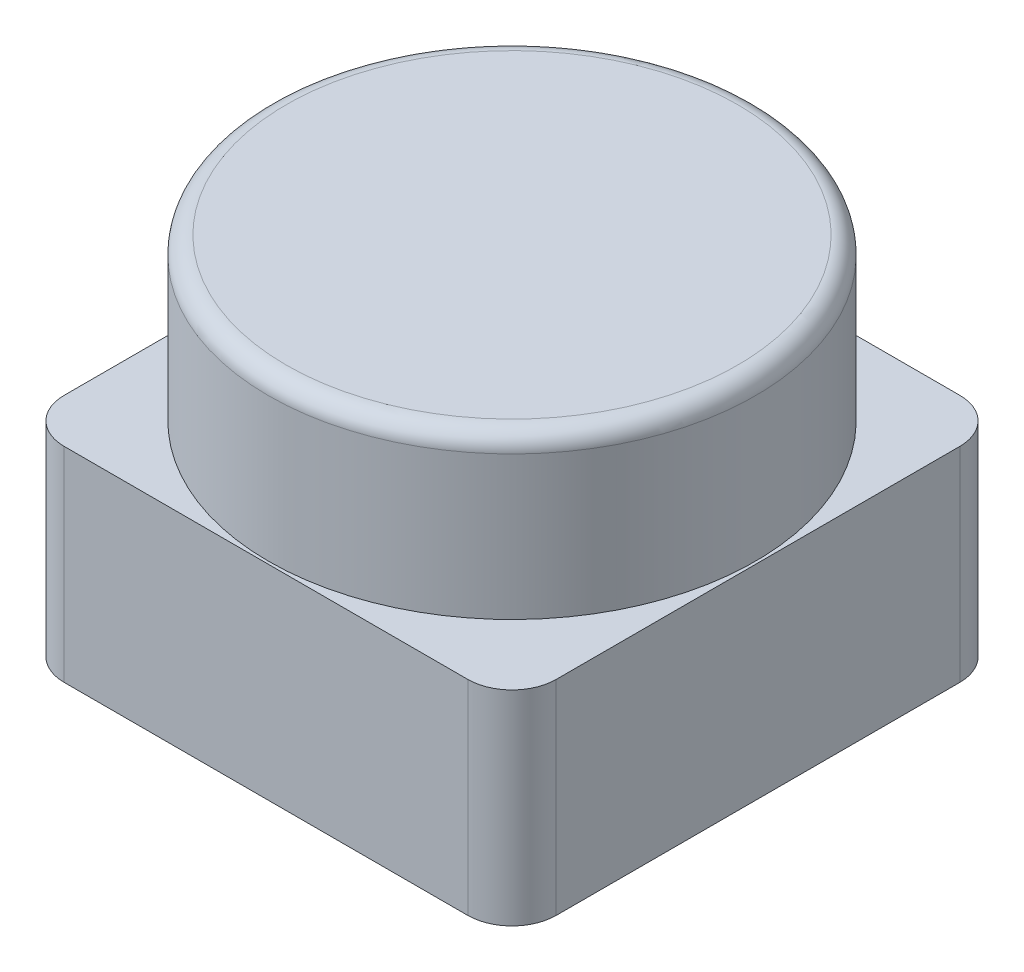
ISO-10303-21;
HEADER;
FILE_DESCRIPTION(('STEP AP214'),'2;1');
FILE_NAME('part.step','',(''),(''),'','','');
FILE_SCHEMA(('AUTOMOTIVE_DESIGN { 1 0 10303 214 1 1 1 1 }'));
ENDSEC;
DATA;
#1=APPLICATION_CONTEXT('core data for automotive mechanical design processes');
#2=APPLICATION_PROTOCOL_DEFINITION('international standard','automotive_design',2000,#1);
#3=PRODUCT_CONTEXT('',#1,'mechanical');
#4=PRODUCT('Part','Part','',(#3));
#5=PRODUCT_RELATED_PRODUCT_CATEGORY('part','',(#4));
#6=PRODUCT_DEFINITION_FORMATION('','',#4);
#7=PRODUCT_DEFINITION_CONTEXT('part definition',#1,'design');
#8=PRODUCT_DEFINITION('design','',#6,#7);
#9=PRODUCT_DEFINITION_SHAPE('','',#8);
#10=(LENGTH_UNIT() NAMED_UNIT(*) SI_UNIT(.MILLI.,.METRE.));
#11=(NAMED_UNIT(*) PLANE_ANGLE_UNIT() SI_UNIT($,.RADIAN.));
#12=(NAMED_UNIT(*) SI_UNIT($,.STERADIAN.) SOLID_ANGLE_UNIT());
#13=UNCERTAINTY_MEASURE_WITH_UNIT(LENGTH_MEASURE(1.E-05),#10,'distance_accuracy_value','');
#14=(GEOMETRIC_REPRESENTATION_CONTEXT(3) GLOBAL_UNCERTAINTY_ASSIGNED_CONTEXT((#13)) GLOBAL_UNIT_ASSIGNED_CONTEXT((#10,
#11,#12)) REPRESENTATION_CONTEXT('',''));
#15=CARTESIAN_POINT('',(0.,0.,0.));
#16=DIRECTION('',(0.,0.,1.));
#17=DIRECTION('',(1.,0.,0.));
#18=AXIS2_PLACEMENT_3D('',#15,#16,#17);
#19=CARTESIAN_POINT('',(27.8,23.1,27.8));
#20=DIRECTION('',(-1.,0.,0.));
#21=DIRECTION('',(0.,0.,1.));
#22=AXIS2_PLACEMENT_3D('',#19,#20,#21);
#23=PLANE('',#22);
#24=DIRECTION('',(0.,0.,-1.));
#25=VECTOR('',#24,1.);
#26=CARTESIAN_POINT('',(27.8,23.1,27.8));
#27=LINE('',#26,#25);
#28=CARTESIAN_POINT('',(27.8,23.1,22.8));
#29=VERTEX_POINT('',#28);
#30=CARTESIAN_POINT('',(27.8,23.1,-22.8));
#31=VERTEX_POINT('',#30);
#32=EDGE_CURVE('E127',#29,#31,#27,.T.);
#33=ORIENTED_EDGE('',*,*,#32,.F.);
#34=DIRECTION('',(0.,-1.,0.));
#35=VECTOR('',#34,1.);
#36=CARTESIAN_POINT('',(27.8,23.1,22.8));
#37=LINE('',#36,#35);
#38=CARTESIAN_POINT('',(27.8,0.,22.8));
#39=VERTEX_POINT('',#38);
#40=EDGE_CURVE('E112',#29,#39,#37,.T.);
#41=ORIENTED_EDGE('',*,*,#40,.T.);
#42=DIRECTION('',(0.,0.,-1.));
#43=VECTOR('',#42,1.);
#44=CARTESIAN_POINT('',(27.8,0.,27.8));
#45=LINE('',#44,#43);
#46=CARTESIAN_POINT('',(27.8,0.,-22.8));
#47=VERTEX_POINT('',#46);
#48=EDGE_CURVE('E124',#39,#47,#45,.T.);
#49=ORIENTED_EDGE('',*,*,#48,.T.);
#50=DIRECTION('',(0.,-1.,0.));
#51=VECTOR('',#50,1.);
#52=CARTESIAN_POINT('',(27.8,23.1,-22.8));
#53=LINE('',#52,#51);
#54=EDGE_CURVE('E129',#47,#31,#53,.F.);
#55=ORIENTED_EDGE('',*,*,#54,.T.);
#56=EDGE_LOOP('',(#33,#41,#49,#55));
#57=FACE_BOUND('',#56,.T.);
#58=ADVANCED_FACE('F41',(#57),#23,.F.);
#59=CARTESIAN_POINT('',(-27.8,23.1,-27.8));
#60=DIRECTION('',(0.,0.,1.));
#61=DIRECTION('',(1.,0.,0.));
#62=AXIS2_PLACEMENT_3D('',#59,#60,#61);
#63=PLANE('',#62);
#64=DIRECTION('',(-1.,0.,0.));
#65=VECTOR('',#64,1.);
#66=CARTESIAN_POINT('',(-27.8,0.,-27.8));
#67=LINE('',#66,#65);
#68=CARTESIAN_POINT('',(22.8,0.,-27.8));
#69=VERTEX_POINT('',#68);
#70=CARTESIAN_POINT('',(-22.8,0.,-27.8));
#71=VERTEX_POINT('',#70);
#72=EDGE_CURVE('E133',#69,#71,#67,.T.);
#73=ORIENTED_EDGE('',*,*,#72,.T.);
#74=DIRECTION('',(0.,-1.,0.));
#75=VECTOR('',#74,1.);
#76=CARTESIAN_POINT('',(-22.8,23.1,-27.8));
#77=LINE('',#76,#75);
#78=CARTESIAN_POINT('',(-22.8,23.1,-27.8));
#79=VERTEX_POINT('',#78);
#80=EDGE_CURVE('E172',#71,#79,#77,.F.);
#81=ORIENTED_EDGE('',*,*,#80,.T.);
#82=DIRECTION('',(-1.,0.,0.));
#83=VECTOR('',#82,1.);
#84=CARTESIAN_POINT('',(-27.8,23.1,-27.8));
#85=LINE('',#84,#83);
#86=CARTESIAN_POINT('',(22.8,23.1,-27.8));
#87=VERTEX_POINT('',#86);
#88=EDGE_CURVE('E223',#87,#79,#85,.T.);
#89=ORIENTED_EDGE('',*,*,#88,.F.);
#90=DIRECTION('',(0.,-1.,0.));
#91=VECTOR('',#90,1.);
#92=CARTESIAN_POINT('',(22.8,23.1,-27.8));
#93=LINE('',#92,#91);
#94=EDGE_CURVE('E169',#87,#69,#93,.T.);
#95=ORIENTED_EDGE('',*,*,#94,.T.);
#96=EDGE_LOOP('',(#73,#81,#89,#95));
#97=FACE_BOUND('',#96,.T.);
#98=ADVANCED_FACE('F189',(#97),#63,.F.);
#99=CARTESIAN_POINT('',(-27.8,23.1,27.8));
#100=DIRECTION('',(1.,0.,0.));
#101=DIRECTION('',(0.,0.,-1.));
#102=AXIS2_PLACEMENT_3D('',#99,#100,#101);
#103=PLANE('',#102);
#104=DIRECTION('',(0.,0.,1.));
#105=VECTOR('',#104,1.);
#106=CARTESIAN_POINT('',(-27.8,0.,27.8));
#107=LINE('',#106,#105);
#108=CARTESIAN_POINT('',(-27.8,0.,-22.8));
#109=VERTEX_POINT('',#108);
#110=CARTESIAN_POINT('',(-27.8,0.,22.8));
#111=VERTEX_POINT('',#110);
#112=EDGE_CURVE('E137',#109,#111,#107,.T.);
#113=ORIENTED_EDGE('',*,*,#112,.T.);
#114=DIRECTION('',(0.,-1.,0.));
#115=VECTOR('',#114,1.);
#116=CARTESIAN_POINT('',(-27.8,23.1,22.8));
#117=LINE('',#116,#115);
#118=CARTESIAN_POINT('',(-27.8,23.1,22.8));
#119=VERTEX_POINT('',#118);
#120=EDGE_CURVE('E56',#111,#119,#117,.F.);
#121=ORIENTED_EDGE('',*,*,#120,.T.);
#122=DIRECTION('',(0.,0.,1.));
#123=VECTOR('',#122,1.);
#124=CARTESIAN_POINT('',(-27.8,23.1,27.8));
#125=LINE('',#124,#123);
#126=CARTESIAN_POINT('',(-27.8,23.1,-22.8));
#127=VERTEX_POINT('',#126);
#128=EDGE_CURVE('E214',#127,#119,#125,.T.);
#129=ORIENTED_EDGE('',*,*,#128,.F.);
#130=DIRECTION('',(0.,-1.,0.));
#131=VECTOR('',#130,1.);
#132=CARTESIAN_POINT('',(-27.8,23.1,-22.8));
#133=LINE('',#132,#131);
#134=EDGE_CURVE('E165',#127,#109,#133,.T.);
#135=ORIENTED_EDGE('',*,*,#134,.T.);
#136=EDGE_LOOP('',(#113,#121,#129,#135));
#137=FACE_BOUND('',#136,.T.);
#138=ADVANCED_FACE('F195',(#137),#103,.F.);
#139=CARTESIAN_POINT('',(-27.8,23.1,27.8));
#140=DIRECTION('',(0.,0.,-1.));
#141=DIRECTION('',(-1.,0.,0.));
#142=AXIS2_PLACEMENT_3D('',#139,#140,#141);
#143=PLANE('',#142);
#144=DIRECTION('',(1.,0.,0.));
#145=VECTOR('',#144,1.);
#146=CARTESIAN_POINT('',(-27.8,0.,27.8));
#147=LINE('',#146,#145);
#148=CARTESIAN_POINT('',(-22.8,0.,27.8));
#149=VERTEX_POINT('',#148);
#150=CARTESIAN_POINT('',(22.8,0.,27.8));
#151=VERTEX_POINT('',#150);
#152=EDGE_CURVE('E147',#149,#151,#147,.T.);
#153=ORIENTED_EDGE('',*,*,#152,.T.);
#154=DIRECTION('',(0.,-1.,0.));
#155=VECTOR('',#154,1.);
#156=CARTESIAN_POINT('',(22.8,23.1,27.8));
#157=LINE('',#156,#155);
#158=CARTESIAN_POINT('',(22.8,23.1,27.8));
#159=VERTEX_POINT('',#158);
#160=EDGE_CURVE('E113',#151,#159,#157,.F.);
#161=ORIENTED_EDGE('',*,*,#160,.T.);
#162=DIRECTION('',(1.,0.,0.));
#163=VECTOR('',#162,1.);
#164=CARTESIAN_POINT('',(-27.8,23.1,27.8));
#165=LINE('',#164,#163);
#166=CARTESIAN_POINT('',(-22.8,23.1,27.8));
#167=VERTEX_POINT('',#166);
#168=EDGE_CURVE('E143',#167,#159,#165,.T.);
#169=ORIENTED_EDGE('',*,*,#168,.F.);
#170=DIRECTION('',(0.,-1.,0.));
#171=VECTOR('',#170,1.);
#172=CARTESIAN_POINT('',(-22.8,23.1,27.8));
#173=LINE('',#172,#171);
#174=EDGE_CURVE('E118',#167,#149,#173,.T.);
#175=ORIENTED_EDGE('',*,*,#174,.T.);
#176=EDGE_LOOP('',(#153,#161,#169,#175));
#177=FACE_BOUND('',#176,.T.);
#178=ADVANCED_FACE('F219',(#177),#143,.F.);
#179=CARTESIAN_POINT('',(0.,23.1,0.));
#180=DIRECTION('',(0.,-1.,0.));
#181=DIRECTION('',(0.,0.,-1.));
#182=AXIS2_PLACEMENT_3D('',#179,#180,#181);
#183=PLANE('',#182);
#184=CARTESIAN_POINT('',(0.,23.1,0.));
#185=DIRECTION('',(0.,1.,0.));
#186=DIRECTION('',(0.,0.,1.));
#187=AXIS2_PLACEMENT_3D('',#184,#185,#186);
#188=CIRCLE('',#187,27.5);
#189=CARTESIAN_POINT('',(0.,23.1,27.5));
#190=VERTEX_POINT('',#189);
#191=EDGE_CURVE('E149',#190,#190,#188,.T.);
#192=ORIENTED_EDGE('',*,*,#191,.F.);
#193=EDGE_LOOP('',(#192));
#194=FACE_BOUND('',#193,.T.);
#195=ORIENTED_EDGE('',*,*,#168,.T.);
#196=CARTESIAN_POINT('',(22.8,23.1,22.8));
#197=DIRECTION('',(0.,-1.,0.));
#198=DIRECTION('',(0.,0.,-1.));
#199=AXIS2_PLACEMENT_3D('',#196,#197,#198);
#200=CIRCLE('',#199,5.);
#201=EDGE_CURVE('E163',#159,#29,#200,.F.);
#202=ORIENTED_EDGE('',*,*,#201,.T.);
#203=ORIENTED_EDGE('',*,*,#32,.T.);
#204=CARTESIAN_POINT('',(22.8,23.1,-22.8));
#205=DIRECTION('',(0.,-1.,0.));
#206=DIRECTION('',(0.,0.,-1.));
#207=AXIS2_PLACEMENT_3D('',#204,#205,#206);
#208=CIRCLE('',#207,5.);
#209=EDGE_CURVE('E158',#31,#87,#208,.F.);
#210=ORIENTED_EDGE('',*,*,#209,.T.);
#211=ORIENTED_EDGE('',*,*,#88,.T.);
#212=CARTESIAN_POINT('',(-22.8,23.1,-22.8));
#213=DIRECTION('',(0.,-1.,0.));
#214=DIRECTION('',(0.,0.,-1.));
#215=AXIS2_PLACEMENT_3D('',#212,#213,#214);
#216=CIRCLE('',#215,5.);
#217=EDGE_CURVE('E63',#79,#127,#216,.F.);
#218=ORIENTED_EDGE('',*,*,#217,.T.);
#219=ORIENTED_EDGE('',*,*,#128,.T.);
#220=CARTESIAN_POINT('',(-22.8,23.1,22.8));
#221=DIRECTION('',(0.,-1.,0.));
#222=DIRECTION('',(0.,0.,-1.));
#223=AXIS2_PLACEMENT_3D('',#220,#221,#222);
#224=CIRCLE('',#223,5.);
#225=EDGE_CURVE('E161',#119,#167,#224,.F.);
#226=ORIENTED_EDGE('',*,*,#225,.T.);
#227=EDGE_LOOP('',(#195,#202,#203,#210,#211,#218,#219,#226));
#228=FACE_BOUND('',#227,.T.);
#229=ADVANCED_FACE('F252',(#194,#228),#183,.F.);
#230=CARTESIAN_POINT('',(0.,0.,0.));
#231=DIRECTION('',(0.,-1.,0.));
#232=DIRECTION('',(0.,0.,-1.));
#233=AXIS2_PLACEMENT_3D('',#230,#231,#232);
#234=PLANE('',#233);
#235=CARTESIAN_POINT('',(21.5,0.,-21.5));
#236=DIRECTION('',(0.,-1.,0.));
#237=DIRECTION('',(0.,0.,-1.));
#238=AXIS2_PLACEMENT_3D('',#235,#236,#237);
#239=CIRCLE('',#238,1.25000000000002);
#240=CARTESIAN_POINT('',(21.5,0.,-22.75));
#241=VERTEX_POINT('',#240);
#242=EDGE_CURVE('E244',#241,#241,#239,.T.);
#243=ORIENTED_EDGE('',*,*,#242,.F.);
#244=EDGE_LOOP('',(#243));
#245=FACE_BOUND('',#244,.T.);
#246=CARTESIAN_POINT('',(-21.5,0.,-21.5));
#247=DIRECTION('',(0.,-1.,0.));
#248=DIRECTION('',(0.,0.,-1.));
#249=AXIS2_PLACEMENT_3D('',#246,#247,#248);
#250=CIRCLE('',#249,1.25000000000002);
#251=CARTESIAN_POINT('',(-21.5,0.,-22.75));
#252=VERTEX_POINT('',#251);
#253=EDGE_CURVE('E238',#252,#252,#250,.T.);
#254=ORIENTED_EDGE('',*,*,#253,.F.);
#255=EDGE_LOOP('',(#254));
#256=FACE_BOUND('',#255,.T.);
#257=CARTESIAN_POINT('',(-21.5,0.,21.5));
#258=DIRECTION('',(0.,-1.,0.));
#259=DIRECTION('',(0.,0.,-1.));
#260=AXIS2_PLACEMENT_3D('',#257,#258,#259);
#261=CIRCLE('',#260,1.25000000000002);
#262=CARTESIAN_POINT('',(-21.5,0.,20.25));
#263=VERTEX_POINT('',#262);
#264=EDGE_CURVE('E232',#263,#263,#261,.T.);
#265=ORIENTED_EDGE('',*,*,#264,.F.);
#266=EDGE_LOOP('',(#265));
#267=FACE_BOUND('',#266,.T.);
#268=CARTESIAN_POINT('',(21.5,0.,21.5));
#269=DIRECTION('',(0.,-1.,0.));
#270=DIRECTION('',(0.,0.,-1.));
#271=AXIS2_PLACEMENT_3D('',#268,#269,#270);
#272=CIRCLE('',#271,1.25000000000002);
#273=CARTESIAN_POINT('',(21.5,0.,20.25));
#274=VERTEX_POINT('',#273);
#275=EDGE_CURVE('E140',#274,#274,#272,.T.);
#276=ORIENTED_EDGE('',*,*,#275,.F.);
#277=EDGE_LOOP('',(#276));
#278=FACE_BOUND('',#277,.T.);
#279=ORIENTED_EDGE('',*,*,#48,.F.);
#280=CARTESIAN_POINT('',(22.8,0.,22.8));
#281=DIRECTION('',(0.,-1.,0.));
#282=DIRECTION('',(0.,0.,-1.));
#283=AXIS2_PLACEMENT_3D('',#280,#281,#282);
#284=CIRCLE('',#283,5.);
#285=EDGE_CURVE('E108',#39,#151,#284,.T.);
#286=ORIENTED_EDGE('',*,*,#285,.T.);
#287=ORIENTED_EDGE('',*,*,#152,.F.);
#288=CARTESIAN_POINT('',(-22.8,0.,22.8));
#289=DIRECTION('',(0.,-1.,0.));
#290=DIRECTION('',(0.,0.,-1.));
#291=AXIS2_PLACEMENT_3D('',#288,#289,#290);
#292=CIRCLE('',#291,5.);
#293=EDGE_CURVE('E119',#149,#111,#292,.T.);
#294=ORIENTED_EDGE('',*,*,#293,.T.);
#295=ORIENTED_EDGE('',*,*,#112,.F.);
#296=CARTESIAN_POINT('',(-22.8,0.,-22.8));
#297=DIRECTION('',(0.,-1.,0.));
#298=DIRECTION('',(0.,0.,-1.));
#299=AXIS2_PLACEMENT_3D('',#296,#297,#298);
#300=CIRCLE('',#299,5.);
#301=EDGE_CURVE('E152',#109,#71,#300,.T.);
#302=ORIENTED_EDGE('',*,*,#301,.T.);
#303=ORIENTED_EDGE('',*,*,#72,.F.);
#304=CARTESIAN_POINT('',(22.8,0.,-22.8));
#305=DIRECTION('',(0.,-1.,0.));
#306=DIRECTION('',(0.,0.,-1.));
#307=AXIS2_PLACEMENT_3D('',#304,#305,#306);
#308=CIRCLE('',#307,5.);
#309=EDGE_CURVE('E128',#69,#47,#308,.T.);
#310=ORIENTED_EDGE('',*,*,#309,.T.);
#311=EDGE_LOOP('',(#279,#286,#287,#294,#295,#302,#303,#310));
#312=FACE_BOUND('',#311,.T.);
#313=ADVANCED_FACE('F131',(#245,#256,#267,#278,#312),#234,.T.);
#314=CARTESIAN_POINT('',(0.,41.3,0.));
#315=DIRECTION('',(0.,-1.,0.));
#316=DIRECTION('',(0.,0.,-1.));
#317=AXIS2_PLACEMENT_3D('',#314,#315,#316);
#318=CYLINDRICAL_SURFACE('',#317,27.5);
#319=CARTESIAN_POINT('',(0.,39.3,0.));
#320=DIRECTION('',(0.,1.,0.));
#321=DIRECTION('',(0.,0.,1.));
#322=AXIS2_PLACEMENT_3D('',#319,#320,#321);
#323=CIRCLE('',#322,27.5);
#324=CARTESIAN_POINT('',(0.,39.3,27.5));
#325=VERTEX_POINT('',#324);
#326=EDGE_CURVE('E11',#325,#325,#323,.F.);
#327=ORIENTED_EDGE('',*,*,#326,.T.);
#328=EDGE_LOOP('',(#327));
#329=FACE_BOUND('',#328,.T.);
#330=ORIENTED_EDGE('',*,*,#191,.T.);
#331=EDGE_LOOP('',(#330));
#332=FACE_BOUND('',#331,.T.);
#333=ADVANCED_FACE('F251',(#329,#332),#318,.T.);
#334=CARTESIAN_POINT('',(0.,41.3,0.));
#335=DIRECTION('',(0.,1.,0.));
#336=DIRECTION('',(0.,0.,1.));
#337=AXIS2_PLACEMENT_3D('',#334,#335,#336);
#338=PLANE('',#337);
#339=CARTESIAN_POINT('',(0.,41.3,0.));
#340=DIRECTION('',(0.,1.,0.));
#341=DIRECTION('',(0.,0.,1.));
#342=AXIS2_PLACEMENT_3D('',#339,#340,#341);
#343=CIRCLE('',#342,25.5);
#344=CARTESIAN_POINT('',(0.,41.3,25.5));
#345=VERTEX_POINT('',#344);
#346=EDGE_CURVE('E49',#345,#345,#343,.T.);
#347=ORIENTED_EDGE('',*,*,#346,.T.);
#348=EDGE_LOOP('',(#347));
#349=FACE_BOUND('',#348,.T.);
#350=ADVANCED_FACE('F176',(#349),#338,.T.);
#351=CARTESIAN_POINT('',(21.5,4.,21.5));
#352=DIRECTION('',(0.,1.,0.));
#353=DIRECTION('',(0.,0.,1.));
#354=AXIS2_PLACEMENT_3D('',#351,#352,#353);
#355=PLANE('',#354);
#356=CARTESIAN_POINT('',(21.5,4.,21.5));
#357=DIRECTION('',(0.,-1.,0.));
#358=DIRECTION('',(0.,0.,-1.));
#359=AXIS2_PLACEMENT_3D('',#356,#357,#358);
#360=CIRCLE('',#359,1.25000000000001);
#361=CARTESIAN_POINT('',(21.5,4.,20.25));
#362=VERTEX_POINT('',#361);
#363=EDGE_CURVE('E134',#362,#362,#360,.T.);
#364=ORIENTED_EDGE('',*,*,#363,.T.);
#365=EDGE_LOOP('',(#364));
#366=FACE_BOUND('',#365,.T.);
#367=ADVANCED_FACE('F263',(#366),#355,.F.);
#368=CARTESIAN_POINT('',(21.5,0.,21.5));
#369=DIRECTION('',(0.,-1.,0.));
#370=DIRECTION('',(0.,0.,-1.));
#371=AXIS2_PLACEMENT_3D('',#368,#369,#370);
#372=CYLINDRICAL_SURFACE('',#371,1.25000000000001);
#373=ORIENTED_EDGE('',*,*,#363,.F.);
#374=EDGE_LOOP('',(#373));
#375=FACE_BOUND('',#374,.T.);
#376=ORIENTED_EDGE('',*,*,#275,.T.);
#377=EDGE_LOOP('',(#376));
#378=FACE_BOUND('',#377,.T.);
#379=ADVANCED_FACE('F260',(#375,#378),#372,.F.);
#380=CARTESIAN_POINT('',(-21.5,4.,21.5));
#381=DIRECTION('',(0.,1.,0.));
#382=DIRECTION('',(0.,0.,1.));
#383=AXIS2_PLACEMENT_3D('',#380,#381,#382);
#384=PLANE('',#383);
#385=CARTESIAN_POINT('',(-21.5,4.,21.5));
#386=DIRECTION('',(0.,-1.,0.));
#387=DIRECTION('',(0.,0.,-1.));
#388=AXIS2_PLACEMENT_3D('',#385,#386,#387);
#389=CIRCLE('',#388,1.25000000000001);
#390=CARTESIAN_POINT('',(-21.5,4.,20.25));
#391=VERTEX_POINT('',#390);
#392=EDGE_CURVE('E229',#391,#391,#389,.T.);
#393=ORIENTED_EDGE('',*,*,#392,.T.);
#394=EDGE_LOOP('',(#393));
#395=FACE_BOUND('',#394,.T.);
#396=ADVANCED_FACE('F262',(#395),#384,.F.);
#397=CARTESIAN_POINT('',(-21.5,0.,21.5));
#398=DIRECTION('',(0.,-1.,0.));
#399=DIRECTION('',(0.,0.,-1.));
#400=AXIS2_PLACEMENT_3D('',#397,#398,#399);
#401=CYLINDRICAL_SURFACE('',#400,1.25000000000001);
#402=ORIENTED_EDGE('',*,*,#392,.F.);
#403=EDGE_LOOP('',(#402));
#404=FACE_BOUND('',#403,.T.);
#405=ORIENTED_EDGE('',*,*,#264,.T.);
#406=EDGE_LOOP('',(#405));
#407=FACE_BOUND('',#406,.T.);
#408=ADVANCED_FACE('F270',(#404,#407),#401,.F.);
#409=CARTESIAN_POINT('',(-21.5,4.,-21.5));
#410=DIRECTION('',(0.,1.,0.));
#411=DIRECTION('',(0.,0.,1.));
#412=AXIS2_PLACEMENT_3D('',#409,#410,#411);
#413=PLANE('',#412);
#414=CARTESIAN_POINT('',(-21.5,4.,-21.5));
#415=DIRECTION('',(0.,-1.,0.));
#416=DIRECTION('',(0.,0.,-1.));
#417=AXIS2_PLACEMENT_3D('',#414,#415,#416);
#418=CIRCLE('',#417,1.25000000000001);
#419=CARTESIAN_POINT('',(-21.5,4.,-22.75));
#420=VERTEX_POINT('',#419);
#421=EDGE_CURVE('E235',#420,#420,#418,.T.);
#422=ORIENTED_EDGE('',*,*,#421,.T.);
#423=EDGE_LOOP('',(#422));
#424=FACE_BOUND('',#423,.T.);
#425=ADVANCED_FACE('F368',(#424),#413,.F.);
#426=CARTESIAN_POINT('',(-21.5,0.,-21.5));
#427=DIRECTION('',(0.,-1.,0.));
#428=DIRECTION('',(0.,0.,-1.));
#429=AXIS2_PLACEMENT_3D('',#426,#427,#428);
#430=CYLINDRICAL_SURFACE('',#429,1.25000000000001);
#431=ORIENTED_EDGE('',*,*,#421,.F.);
#432=EDGE_LOOP('',(#431));
#433=FACE_BOUND('',#432,.T.);
#434=ORIENTED_EDGE('',*,*,#253,.T.);
#435=EDGE_LOOP('',(#434));
#436=FACE_BOUND('',#435,.T.);
#437=ADVANCED_FACE('F377',(#433,#436),#430,.F.);
#438=CARTESIAN_POINT('',(21.5,4.,-21.5));
#439=DIRECTION('',(0.,1.,0.));
#440=DIRECTION('',(0.,0.,1.));
#441=AXIS2_PLACEMENT_3D('',#438,#439,#440);
#442=PLANE('',#441);
#443=CARTESIAN_POINT('',(21.5,4.,-21.5));
#444=DIRECTION('',(0.,-1.,0.));
#445=DIRECTION('',(0.,0.,-1.));
#446=AXIS2_PLACEMENT_3D('',#443,#444,#445);
#447=CIRCLE('',#446,1.25000000000001);
#448=CARTESIAN_POINT('',(21.5,4.,-22.75));
#449=VERTEX_POINT('',#448);
#450=EDGE_CURVE('E241',#449,#449,#447,.T.);
#451=ORIENTED_EDGE('',*,*,#450,.T.);
#452=EDGE_LOOP('',(#451));
#453=FACE_BOUND('',#452,.T.);
#454=ADVANCED_FACE('F387',(#453),#442,.F.);
#455=CARTESIAN_POINT('',(21.5,0.,-21.5));
#456=DIRECTION('',(0.,-1.,0.));
#457=DIRECTION('',(0.,0.,-1.));
#458=AXIS2_PLACEMENT_3D('',#455,#456,#457);
#459=CYLINDRICAL_SURFACE('',#458,1.25000000000001);
#460=ORIENTED_EDGE('',*,*,#450,.F.);
#461=EDGE_LOOP('',(#460));
#462=FACE_BOUND('',#461,.T.);
#463=ORIENTED_EDGE('',*,*,#242,.T.);
#464=EDGE_LOOP('',(#463));
#465=FACE_BOUND('',#464,.T.);
#466=ADVANCED_FACE('F203',(#462,#465),#459,.F.);
#467=CARTESIAN_POINT('',(22.8,23.1,22.8));
#468=DIRECTION('',(0.,-1.,0.));
#469=DIRECTION('',(0.,0.,-1.));
#470=AXIS2_PLACEMENT_3D('',#467,#468,#469);
#471=CYLINDRICAL_SURFACE('',#470,5.);
#472=ORIENTED_EDGE('',*,*,#201,.F.);
#473=ORIENTED_EDGE('',*,*,#160,.F.);
#474=ORIENTED_EDGE('',*,*,#285,.F.);
#475=ORIENTED_EDGE('',*,*,#40,.F.);
#476=EDGE_LOOP('',(#472,#473,#474,#475));
#477=FACE_BOUND('',#476,.T.);
#478=ADVANCED_FACE('F111',(#477),#471,.T.);
#479=CARTESIAN_POINT('',(-22.8,23.1,22.8));
#480=DIRECTION('',(0.,-1.,0.));
#481=DIRECTION('',(0.,0.,-1.));
#482=AXIS2_PLACEMENT_3D('',#479,#480,#481);
#483=CYLINDRICAL_SURFACE('',#482,5.);
#484=ORIENTED_EDGE('',*,*,#225,.F.);
#485=ORIENTED_EDGE('',*,*,#120,.F.);
#486=ORIENTED_EDGE('',*,*,#293,.F.);
#487=ORIENTED_EDGE('',*,*,#174,.F.);
#488=EDGE_LOOP('',(#484,#485,#486,#487));
#489=FACE_BOUND('',#488,.T.);
#490=ADVANCED_FACE('F202',(#489),#483,.T.);
#491=CARTESIAN_POINT('',(-22.8,23.1,-22.8));
#492=DIRECTION('',(0.,-1.,0.));
#493=DIRECTION('',(0.,0.,-1.));
#494=AXIS2_PLACEMENT_3D('',#491,#492,#493);
#495=CYLINDRICAL_SURFACE('',#494,5.);
#496=ORIENTED_EDGE('',*,*,#217,.F.);
#497=ORIENTED_EDGE('',*,*,#80,.F.);
#498=ORIENTED_EDGE('',*,*,#301,.F.);
#499=ORIENTED_EDGE('',*,*,#134,.F.);
#500=EDGE_LOOP('',(#496,#497,#498,#499));
#501=FACE_BOUND('',#500,.T.);
#502=ADVANCED_FACE('F185',(#501),#495,.T.);
#503=CARTESIAN_POINT('',(22.8,23.1,-22.8));
#504=DIRECTION('',(0.,-1.,0.));
#505=DIRECTION('',(0.,0.,-1.));
#506=AXIS2_PLACEMENT_3D('',#503,#504,#505);
#507=CYLINDRICAL_SURFACE('',#506,5.);
#508=ORIENTED_EDGE('',*,*,#209,.F.);
#509=ORIENTED_EDGE('',*,*,#54,.F.);
#510=ORIENTED_EDGE('',*,*,#309,.F.);
#511=ORIENTED_EDGE('',*,*,#94,.F.);
#512=EDGE_LOOP('',(#508,#509,#510,#511));
#513=FACE_BOUND('',#512,.T.);
#514=ADVANCED_FACE('F179',(#513),#507,.T.);
#515=CARTESIAN_POINT('',(0.,39.3,0.));
#516=DIRECTION('',(0.,1.,0.));
#517=DIRECTION('',(0.,0.,1.));
#518=AXIS2_PLACEMENT_3D('',#515,#516,#517);
#519=TOROIDAL_SURFACE('',#518,25.5,2.);
#520=ORIENTED_EDGE('',*,*,#326,.F.);
#521=EDGE_LOOP('',(#520));
#522=FACE_BOUND('',#521,.T.);
#523=ORIENTED_EDGE('',*,*,#346,.F.);
#524=EDGE_LOOP('',(#523));
#525=FACE_BOUND('',#524,.T.);
#526=ADVANCED_FACE('F43',(#522,#525),#519,.T.);
#527=CLOSED_SHELL('',(#58,#98,#138,#178,#229,#313,#333,#350,#367,#379,#396,#408,#425,#437,#454,
#466,#478,#490,#502,#514,#526));
#528=MANIFOLD_SOLID_BREP('B2',#527);
#529=ADVANCED_BREP_SHAPE_REPRESENTATION('',(#18,#528),#14);
#530=SHAPE_DEFINITION_REPRESENTATION(#9,#529);
ENDSEC;
END-ISO-10303-21;
